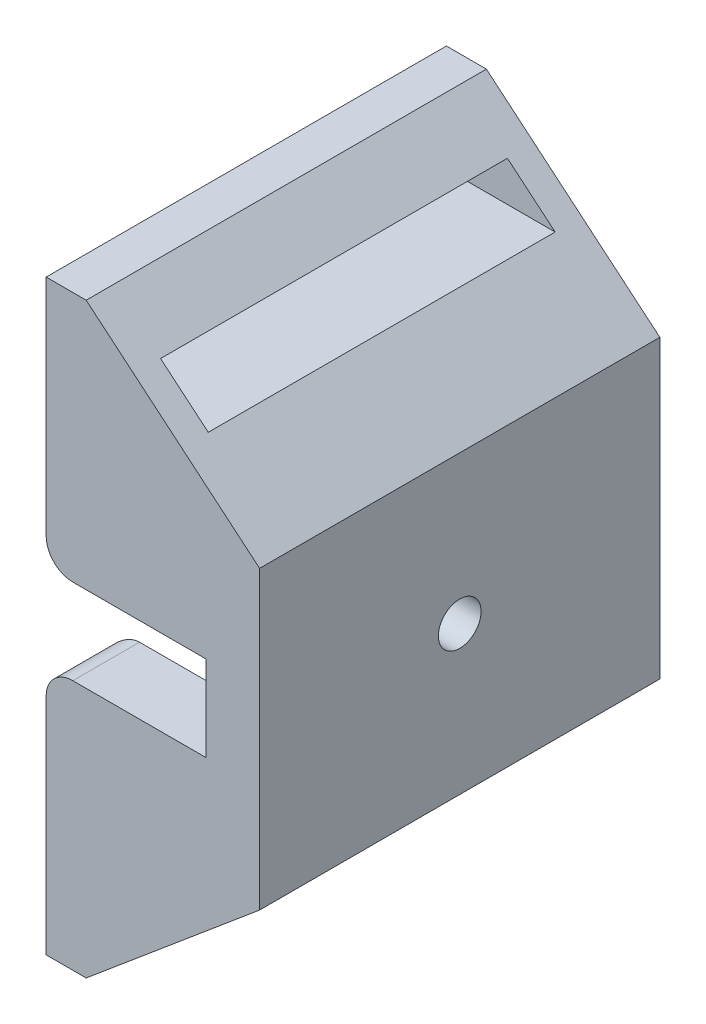
ISO-10303-21;
HEADER;
FILE_DESCRIPTION(('STEP AP214'),'2;1');
FILE_NAME('part.step','',(''),(''),'','','');
FILE_SCHEMA(('AUTOMOTIVE_DESIGN { 1 0 10303 214 1 1 1 1 }'));
ENDSEC;
DATA;
#1=APPLICATION_CONTEXT('core data for automotive mechanical design processes');
#2=APPLICATION_PROTOCOL_DEFINITION('international standard','automotive_design',2000,#1);
#3=PRODUCT_CONTEXT('',#1,'mechanical');
#4=PRODUCT('Part','Part','',(#3));
#5=PRODUCT_RELATED_PRODUCT_CATEGORY('part','',(#4));
#6=PRODUCT_DEFINITION_FORMATION('','',#4);
#7=PRODUCT_DEFINITION_CONTEXT('part definition',#1,'design');
#8=PRODUCT_DEFINITION('design','',#6,#7);
#9=PRODUCT_DEFINITION_SHAPE('','',#8);
#10=(LENGTH_UNIT() NAMED_UNIT(*) SI_UNIT(.MILLI.,.METRE.));
#11=(NAMED_UNIT(*) PLANE_ANGLE_UNIT() SI_UNIT($,.RADIAN.));
#12=(NAMED_UNIT(*) SI_UNIT($,.STERADIAN.) SOLID_ANGLE_UNIT());
#13=UNCERTAINTY_MEASURE_WITH_UNIT(LENGTH_MEASURE(1.E-05),#10,'distance_accuracy_value','');
#14=(GEOMETRIC_REPRESENTATION_CONTEXT(3) GLOBAL_UNCERTAINTY_ASSIGNED_CONTEXT((#13)) GLOBAL_UNIT_ASSIGNED_CONTEXT((#10,
#11,#12)) REPRESENTATION_CONTEXT('',''));
#15=CARTESIAN_POINT('',(0.,0.,0.));
#16=DIRECTION('',(0.,0.,1.));
#17=DIRECTION('',(1.,0.,0.));
#18=AXIS2_PLACEMENT_3D('',#15,#16,#17);
#19=CARTESIAN_POINT('',(-8.,-11.,0.));
#20=DIRECTION('',(0.,0.,-1.));
#21=DIRECTION('',(-1.,0.,0.));
#22=AXIS2_PLACEMENT_3D('',#19,#20,#21);
#23=PLANE('',#22);
#24=DIRECTION('',(0.,1.,0.));
#25=VECTOR('',#24,1.);
#26=CARTESIAN_POINT('',(-8.,-11.,0.));
#27=LINE('',#26,#25);
#28=CARTESIAN_POINT('',(-8.,2.6,0.));
#29=VERTEX_POINT('',#28);
#30=CARTESIAN_POINT('',(-8.,11.,0.));
#31=VERTEX_POINT('',#30);
#32=EDGE_CURVE('E516',#29,#31,#27,.T.);
#33=ORIENTED_EDGE('',*,*,#32,.F.);
#34=CARTESIAN_POINT('',(-7.,2.6,0.));
#35=DIRECTION('',(0.,0.,-1.));
#36=DIRECTION('',(-1.,0.,0.));
#37=AXIS2_PLACEMENT_3D('',#34,#35,#36);
#38=CIRCLE('',#37,1.);
#39=CARTESIAN_POINT('',(-7.,1.6,0.));
#40=VERTEX_POINT('',#39);
#41=EDGE_CURVE('E256',#29,#40,#38,.F.);
#42=ORIENTED_EDGE('',*,*,#41,.T.);
#43=DIRECTION('',(-1.,0.,0.));
#44=VECTOR('',#43,1.);
#45=CARTESIAN_POINT('',(-8.,1.6,0.));
#46=LINE('',#45,#44);
#47=CARTESIAN_POINT('',(-2.,1.6,0.));
#48=VERTEX_POINT('',#47);
#49=EDGE_CURVE('E545',#48,#40,#46,.T.);
#50=ORIENTED_EDGE('',*,*,#49,.F.);
#51=DIRECTION('',(0.,1.,0.));
#52=VECTOR('',#51,1.);
#53=CARTESIAN_POINT('',(-2.,1.6,0.));
#54=LINE('',#53,#52);
#55=CARTESIAN_POINT('',(-2.,-1.6,0.));
#56=VERTEX_POINT('',#55);
#57=EDGE_CURVE('E548',#56,#48,#54,.T.);
#58=ORIENTED_EDGE('',*,*,#57,.F.);
#59=DIRECTION('',(1.,0.,0.));
#60=VECTOR('',#59,1.);
#61=CARTESIAN_POINT('',(-8.,-1.6,0.));
#62=LINE('',#61,#60);
#63=CARTESIAN_POINT('',(-7.,-1.6,0.));
#64=VERTEX_POINT('',#63);
#65=EDGE_CURVE('E512',#64,#56,#62,.T.);
#66=ORIENTED_EDGE('',*,*,#65,.F.);
#67=CARTESIAN_POINT('',(-7.,-2.6,0.));
#68=DIRECTION('',(0.,0.,-1.));
#69=DIRECTION('',(-1.,0.,0.));
#70=AXIS2_PLACEMENT_3D('',#67,#68,#69);
#71=CIRCLE('',#70,1.);
#72=CARTESIAN_POINT('',(-8.,-2.6,0.));
#73=VERTEX_POINT('',#72);
#74=EDGE_CURVE('E253',#64,#73,#71,.F.);
#75=ORIENTED_EDGE('',*,*,#74,.T.);
#76=CARTESIAN_POINT('',(-8.,-11.,0.));
#77=VERTEX_POINT('',#76);
#78=EDGE_CURVE('E510',#77,#73,#27,.T.);
#79=ORIENTED_EDGE('',*,*,#78,.F.);
#80=DIRECTION('',(1.,0.,0.));
#81=VECTOR('',#80,1.);
#82=CARTESIAN_POINT('',(-8.,-11.,0.));
#83=LINE('',#82,#81);
#84=CARTESIAN_POINT('',(-6.5,-11.,0.));
#85=VERTEX_POINT('',#84);
#86=EDGE_CURVE('E222',#77,#85,#83,.T.);
#87=ORIENTED_EDGE('',*,*,#86,.T.);
#88=DIRECTION('',(-0.766044443118981,-0.642787609686535,0.));
#89=VECTOR('',#88,1.);
#90=CARTESIAN_POINT('',(-6.5,-11.,0.));
#91=LINE('',#90,#89);
#92=CARTESIAN_POINT('',(0.,-5.54585239734774,0.));
#93=VERTEX_POINT('',#92);
#94=EDGE_CURVE('E197',#93,#85,#91,.T.);
#95=ORIENTED_EDGE('',*,*,#94,.F.);
#96=DIRECTION('',(0.,1.,0.));
#97=VECTOR('',#96,1.);
#98=CARTESIAN_POINT('',(0.,-11.,0.));
#99=LINE('',#98,#97);
#100=CARTESIAN_POINT('',(0.,5.54585239734775,0.));
#101=VERTEX_POINT('',#100);
#102=EDGE_CURVE('E530',#93,#101,#99,.T.);
#103=ORIENTED_EDGE('',*,*,#102,.T.);
#104=DIRECTION('',(0.766044443118982,-0.642787609686534,0.));
#105=VECTOR('',#104,1.);
#106=CARTESIAN_POINT('',(-6.5,11.,0.));
#107=LINE('',#106,#105);
#108=CARTESIAN_POINT('',(-6.5,11.,0.));
#109=VERTEX_POINT('',#108);
#110=EDGE_CURVE('E656',#109,#101,#107,.T.);
#111=ORIENTED_EDGE('',*,*,#110,.F.);
#112=DIRECTION('',(1.,0.,0.));
#113=VECTOR('',#112,1.);
#114=CARTESIAN_POINT('',(-8.,11.,0.));
#115=LINE('',#114,#113);
#116=EDGE_CURVE('E227',#31,#109,#115,.T.);
#117=ORIENTED_EDGE('',*,*,#116,.F.);
#118=EDGE_LOOP('',(#33,#42,#50,#58,#66,#75,#79,#87,#95,#103,#111,#117));
#119=FACE_BOUND('',#118,.T.);
#120=ADVANCED_FACE('F45',(#119),#23,.F.);
#121=CARTESIAN_POINT('',(-8.,11.,-15.));
#122=DIRECTION('',(0.,-1.,0.));
#123=DIRECTION('',(0.,0.,-1.));
#124=AXIS2_PLACEMENT_3D('',#121,#122,#123);
#125=PLANE('',#124);
#126=ORIENTED_EDGE('',*,*,#116,.T.);
#127=DIRECTION('',(0.,0.,1.));
#128=VECTOR('',#127,1.);
#129=CARTESIAN_POINT('',(-6.5,11.,-15.));
#130=LINE('',#129,#128);
#131=CARTESIAN_POINT('',(-6.5,11.,-15.));
#132=VERTEX_POINT('',#131);
#133=EDGE_CURVE('E662',#132,#109,#130,.T.);
#134=ORIENTED_EDGE('',*,*,#133,.F.);
#135=DIRECTION('',(1.,0.,0.));
#136=VECTOR('',#135,1.);
#137=CARTESIAN_POINT('',(-8.,11.,-15.));
#138=LINE('',#137,#136);
#139=CARTESIAN_POINT('',(-8.,11.,-15.));
#140=VERTEX_POINT('',#139);
#141=EDGE_CURVE('E221',#140,#132,#138,.T.);
#142=ORIENTED_EDGE('',*,*,#141,.F.);
#143=DIRECTION('',(0.,0.,-1.));
#144=VECTOR('',#143,1.);
#145=CARTESIAN_POINT('',(-8.,11.,-15.));
#146=LINE('',#145,#144);
#147=EDGE_CURVE('E515',#31,#140,#146,.T.);
#148=ORIENTED_EDGE('',*,*,#147,.F.);
#149=EDGE_LOOP('',(#126,#134,#142,#148));
#150=FACE_BOUND('',#149,.T.);
#151=ADVANCED_FACE('F281',(#150),#125,.F.);
#152=CARTESIAN_POINT('',(-8.,-11.,-15.));
#153=DIRECTION('',(0.,0.,1.));
#154=DIRECTION('',(1.,0.,0.));
#155=AXIS2_PLACEMENT_3D('',#152,#153,#154);
#156=PLANE('',#155);
#157=DIRECTION('',(0.,-1.,0.));
#158=VECTOR('',#157,1.);
#159=CARTESIAN_POINT('',(0.,-11.,-15.));
#160=LINE('',#159,#158);
#161=CARTESIAN_POINT('',(0.,5.54585239734775,-15.));
#162=VERTEX_POINT('',#161);
#163=CARTESIAN_POINT('',(0.,-5.54585239734774,-15.));
#164=VERTEX_POINT('',#163);
#165=EDGE_CURVE('E215',#162,#164,#160,.T.);
#166=ORIENTED_EDGE('',*,*,#165,.T.);
#167=DIRECTION('',(-0.766044443118981,-0.642787609686535,0.));
#168=VECTOR('',#167,1.);
#169=CARTESIAN_POINT('',(-6.5,-11.,-15.));
#170=LINE('',#169,#168);
#171=CARTESIAN_POINT('',(-6.5,-11.,-15.));
#172=VERTEX_POINT('',#171);
#173=EDGE_CURVE('E194',#164,#172,#170,.T.);
#174=ORIENTED_EDGE('',*,*,#173,.T.);
#175=DIRECTION('',(1.,0.,0.));
#176=VECTOR('',#175,1.);
#177=CARTESIAN_POINT('',(-8.,-11.,-15.));
#178=LINE('',#177,#176);
#179=CARTESIAN_POINT('',(-8.,-11.,-15.));
#180=VERTEX_POINT('',#179);
#181=EDGE_CURVE('E211',#180,#172,#178,.T.);
#182=ORIENTED_EDGE('',*,*,#181,.F.);
#183=DIRECTION('',(0.,-1.,0.));
#184=VECTOR('',#183,1.);
#185=CARTESIAN_POINT('',(-8.,-11.,-15.));
#186=LINE('',#185,#184);
#187=EDGE_CURVE('E520',#140,#180,#186,.T.);
#188=ORIENTED_EDGE('',*,*,#187,.F.);
#189=ORIENTED_EDGE('',*,*,#141,.T.);
#190=DIRECTION('',(0.766044443118982,-0.642787609686534,0.));
#191=VECTOR('',#190,1.);
#192=CARTESIAN_POINT('',(-6.5,11.,-15.));
#193=LINE('',#192,#191);
#194=EDGE_CURVE('E659',#132,#162,#193,.T.);
#195=ORIENTED_EDGE('',*,*,#194,.T.);
#196=EDGE_LOOP('',(#166,#174,#182,#188,#189,#195));
#197=FACE_BOUND('',#196,.T.);
#198=ADVANCED_FACE('F209',(#197),#156,.F.);
#199=CARTESIAN_POINT('',(-8.,-11.,-15.));
#200=DIRECTION('',(0.,1.,0.));
#201=DIRECTION('',(0.,0.,1.));
#202=AXIS2_PLACEMENT_3D('',#199,#200,#201);
#203=PLANE('',#202);
#204=ORIENTED_EDGE('',*,*,#181,.T.);
#205=DIRECTION('',(0.,0.,1.));
#206=VECTOR('',#205,1.);
#207=CARTESIAN_POINT('',(-6.5,-11.,-15.));
#208=LINE('',#207,#206);
#209=EDGE_CURVE('E190',#172,#85,#208,.T.);
#210=ORIENTED_EDGE('',*,*,#209,.T.);
#211=ORIENTED_EDGE('',*,*,#86,.F.);
#212=DIRECTION('',(0.,0.,1.));
#213=VECTOR('',#212,1.);
#214=CARTESIAN_POINT('',(-8.,-11.,-15.));
#215=LINE('',#214,#213);
#216=EDGE_CURVE('E219',#180,#77,#215,.T.);
#217=ORIENTED_EDGE('',*,*,#216,.F.);
#218=EDGE_LOOP('',(#204,#210,#211,#217));
#219=FACE_BOUND('',#218,.T.);
#220=ADVANCED_FACE('F218',(#219),#203,.F.);
#221=CARTESIAN_POINT('',(-8.,0.,0.));
#222=DIRECTION('',(1.,0.,0.));
#223=DIRECTION('',(0.,0.,-1.));
#224=AXIS2_PLACEMENT_3D('',#221,#222,#223);
#225=PLANE('',#224);
#226=DIRECTION('',(0.,0.,1.));
#227=VECTOR('',#226,1.);
#228=CARTESIAN_POINT('',(-8.,-8.,0.));
#229=LINE('',#228,#227);
#230=CARTESIAN_POINT('',(-8.,-8.,-14.));
#231=VERTEX_POINT('',#230);
#232=CARTESIAN_POINT('',(-8.,-8.,-1.));
#233=VERTEX_POINT('',#232);
#234=EDGE_CURVE('E561',#231,#233,#229,.T.);
#235=ORIENTED_EDGE('',*,*,#234,.T.);
#236=DIRECTION('',(0.,-1.,0.));
#237=VECTOR('',#236,1.);
#238=CARTESIAN_POINT('',(-8.,0.,-1.));
#239=LINE('',#238,#237);
#240=CARTESIAN_POINT('',(-8.,-9.5,-1.));
#241=VERTEX_POINT('',#240);
#242=EDGE_CURVE('E557',#233,#241,#239,.T.);
#243=ORIENTED_EDGE('',*,*,#242,.T.);
#244=DIRECTION('',(0.,0.,-1.));
#245=VECTOR('',#244,1.);
#246=CARTESIAN_POINT('',(-8.,-9.5,0.));
#247=LINE('',#246,#245);
#248=CARTESIAN_POINT('',(-8.,-9.5,-14.));
#249=VERTEX_POINT('',#248);
#250=EDGE_CURVE('E569',#241,#249,#247,.T.);
#251=ORIENTED_EDGE('',*,*,#250,.T.);
#252=DIRECTION('',(0.,1.,0.));
#253=VECTOR('',#252,1.);
#254=CARTESIAN_POINT('',(-8.,0.,-14.));
#255=LINE('',#254,#253);
#256=EDGE_CURVE('E565',#249,#231,#255,.T.);
#257=ORIENTED_EDGE('',*,*,#256,.T.);
#258=EDGE_LOOP('',(#235,#243,#251,#257));
#259=FACE_BOUND('',#258,.T.);
#260=DIRECTION('',(0.,0.,1.));
#261=VECTOR('',#260,1.);
#262=CARTESIAN_POINT('',(-8.,9.5,0.));
#263=LINE('',#262,#261);
#264=CARTESIAN_POINT('',(-8.,9.5,-14.));
#265=VERTEX_POINT('',#264);
#266=CARTESIAN_POINT('',(-8.,9.5,-1.));
#267=VERTEX_POINT('',#266);
#268=EDGE_CURVE('E577',#265,#267,#263,.T.);
#269=ORIENTED_EDGE('',*,*,#268,.T.);
#270=DIRECTION('',(0.,-1.,0.));
#271=VECTOR('',#270,1.);
#272=CARTESIAN_POINT('',(-8.,0.,-1.));
#273=LINE('',#272,#271);
#274=CARTESIAN_POINT('',(-8.,8.,-1.));
#275=VERTEX_POINT('',#274);
#276=EDGE_CURVE('E573',#267,#275,#273,.T.);
#277=ORIENTED_EDGE('',*,*,#276,.T.);
#278=DIRECTION('',(0.,0.,-1.));
#279=VECTOR('',#278,1.);
#280=CARTESIAN_POINT('',(-8.,8.,0.));
#281=LINE('',#280,#279);
#282=CARTESIAN_POINT('',(-8.,8.,-14.));
#283=VERTEX_POINT('',#282);
#284=EDGE_CURVE('E585',#275,#283,#281,.T.);
#285=ORIENTED_EDGE('',*,*,#284,.T.);
#286=DIRECTION('',(0.,1.,0.));
#287=VECTOR('',#286,1.);
#288=CARTESIAN_POINT('',(-8.,0.,-14.));
#289=LINE('',#288,#287);
#290=EDGE_CURVE('E581',#283,#265,#289,.T.);
#291=ORIENTED_EDGE('',*,*,#290,.T.);
#292=EDGE_LOOP('',(#269,#277,#285,#291));
#293=FACE_BOUND('',#292,.T.);
#294=CARTESIAN_POINT('',(-8.,0.,-7.5));
#295=DIRECTION('',(1.,0.,0.));
#296=DIRECTION('',(0.,0.,-1.));
#297=AXIS2_PLACEMENT_3D('',#294,#295,#296);
#298=CIRCLE('',#297,6.25);
#299=CARTESIAN_POINT('',(-8.,-2.6,-1.81647116660784));
#300=VERTEX_POINT('',#299);
#301=CARTESIAN_POINT('',(-8.,2.6,-1.81647116660784));
#302=VERTEX_POINT('',#301);
#303=EDGE_CURVE('E243',#300,#302,#298,.T.);
#304=ORIENTED_EDGE('',*,*,#303,.T.);
#305=DIRECTION('',(0.,0.,1.));
#306=VECTOR('',#305,1.);
#307=CARTESIAN_POINT('',(-8.,2.6,0.));
#308=LINE('',#307,#306);
#309=EDGE_CURVE('E249',#302,#29,#308,.T.);
#310=ORIENTED_EDGE('',*,*,#309,.T.);
#311=ORIENTED_EDGE('',*,*,#32,.T.);
#312=ORIENTED_EDGE('',*,*,#147,.T.);
#313=ORIENTED_EDGE('',*,*,#187,.T.);
#314=ORIENTED_EDGE('',*,*,#216,.T.);
#315=ORIENTED_EDGE('',*,*,#78,.T.);
#316=DIRECTION('',(0.,0.,1.));
#317=VECTOR('',#316,1.);
#318=CARTESIAN_POINT('',(-8.,-2.6,0.));
#319=LINE('',#318,#317);
#320=EDGE_CURVE('E246',#73,#300,#319,.F.);
#321=ORIENTED_EDGE('',*,*,#320,.T.);
#322=EDGE_LOOP('',(#304,#310,#311,#312,#313,#314,#315,#321));
#323=FACE_BOUND('',#322,.T.);
#324=ADVANCED_FACE('F296',(#259,#293,#323),#225,.F.);
#325=CARTESIAN_POINT('',(0.,0.,0.));
#326=DIRECTION('',(1.,0.,0.));
#327=DIRECTION('',(0.,0.,-1.));
#328=AXIS2_PLACEMENT_3D('',#325,#326,#327);
#329=PLANE('',#328);
#330=DIRECTION('',(0.,0.,1.));
#331=VECTOR('',#330,1.);
#332=CARTESIAN_POINT('',(0.,-5.54585239734774,-15.));
#333=LINE('',#332,#331);
#334=EDGE_CURVE('E204',#164,#93,#333,.T.);
#335=ORIENTED_EDGE('',*,*,#334,.F.);
#336=ORIENTED_EDGE('',*,*,#165,.F.);
#337=DIRECTION('',(0.,0.,1.));
#338=VECTOR('',#337,1.);
#339=CARTESIAN_POINT('',(0.,5.54585239734775,-15.));
#340=LINE('',#339,#338);
#341=EDGE_CURVE('E665',#162,#101,#340,.T.);
#342=ORIENTED_EDGE('',*,*,#341,.T.);
#343=ORIENTED_EDGE('',*,*,#102,.F.);
#344=EDGE_LOOP('',(#335,#336,#342,#343));
#345=FACE_BOUND('',#344,.T.);
#346=CARTESIAN_POINT('',(0.,0.,-7.5));
#347=DIRECTION('',(-1.,0.,0.));
#348=DIRECTION('',(0.,0.,1.));
#349=AXIS2_PLACEMENT_3D('',#346,#347,#348);
#350=CIRCLE('',#349,0.800000000000001);
#351=CARTESIAN_POINT('',(0.,0.,-6.7));
#352=VERTEX_POINT('',#351);
#353=EDGE_CURVE('E621',#352,#352,#350,.T.);
#354=ORIENTED_EDGE('',*,*,#353,.T.);
#355=EDGE_LOOP('',(#354));
#356=FACE_BOUND('',#355,.T.);
#357=ADVANCED_FACE('F297',(#345,#356),#329,.T.);
#358=CARTESIAN_POINT('',(-2.,0.,-7.5));
#359=DIRECTION('',(-1.,0.,0.));
#360=DIRECTION('',(0.,0.,1.));
#361=AXIS2_PLACEMENT_3D('',#358,#359,#360);
#362=CYLINDRICAL_SURFACE('',#361,5.25);
#363=DIRECTION('',(-1.,0.,0.));
#364=VECTOR('',#363,1.);
#365=CARTESIAN_POINT('',(-2.,1.6,-2.49975000624969));
#366=LINE('',#365,#364);
#367=CARTESIAN_POINT('',(-7.,1.6,-2.49975000624969));
#368=VERTEX_POINT('',#367);
#369=CARTESIAN_POINT('',(-2.,1.6,-2.49975000624969));
#370=VERTEX_POINT('',#369);
#371=EDGE_CURVE('E554',#368,#370,#366,.F.);
#372=ORIENTED_EDGE('',*,*,#371,.F.);
#373=CARTESIAN_POINT('',(-7.,0.,-7.5));
#374=DIRECTION('',(1.,0.,0.));
#375=DIRECTION('',(0.,0.,-1.));
#376=AXIS2_PLACEMENT_3D('',#373,#374,#375);
#377=CIRCLE('',#376,5.25);
#378=CARTESIAN_POINT('',(-7.,-1.6,-2.49975000624969));
#379=VERTEX_POINT('',#378);
#380=EDGE_CURVE('E11',#368,#379,#377,.F.);
#381=ORIENTED_EDGE('',*,*,#380,.T.);
#382=DIRECTION('',(-1.,0.,0.));
#383=VECTOR('',#382,1.);
#384=CARTESIAN_POINT('',(-2.,-1.6,-2.49975000624969));
#385=LINE('',#384,#383);
#386=CARTESIAN_POINT('',(-2.,-1.6,-2.49975000624969));
#387=VERTEX_POINT('',#386);
#388=EDGE_CURVE('E537',#387,#379,#385,.T.);
#389=ORIENTED_EDGE('',*,*,#388,.F.);
#390=CARTESIAN_POINT('',(-2.,0.,-7.5));
#391=DIRECTION('',(-1.,0.,0.));
#392=DIRECTION('',(0.,0.,1.));
#393=AXIS2_PLACEMENT_3D('',#390,#391,#392);
#394=CIRCLE('',#393,5.25);
#395=EDGE_CURVE('E523',#370,#387,#394,.T.);
#396=ORIENTED_EDGE('',*,*,#395,.F.);
#397=EDGE_LOOP('',(#372,#381,#389,#396));
#398=FACE_BOUND('',#397,.T.);
#399=ADVANCED_FACE('F300',(#398),#362,.F.);
#400=CARTESIAN_POINT('',(-2.,0.,-7.5));
#401=DIRECTION('',(-1.,0.,0.));
#402=DIRECTION('',(0.,0.,1.));
#403=AXIS2_PLACEMENT_3D('',#400,#401,#402);
#404=PLANE('',#403);
#405=CARTESIAN_POINT('',(-2.,0.,-7.5));
#406=DIRECTION('',(-1.,0.,0.));
#407=DIRECTION('',(0.,0.,1.));
#408=AXIS2_PLACEMENT_3D('',#405,#406,#407);
#409=CIRCLE('',#408,0.800000000000001);
#410=CARTESIAN_POINT('',(-2.,0.,-6.7));
#411=VERTEX_POINT('',#410);
#412=EDGE_CURVE('E625',#411,#411,#409,.T.);
#413=ORIENTED_EDGE('',*,*,#412,.F.);
#414=EDGE_LOOP('',(#413));
#415=FACE_BOUND('',#414,.T.);
#416=ORIENTED_EDGE('',*,*,#395,.T.);
#417=DIRECTION('',(0.,0.,1.));
#418=VECTOR('',#417,1.);
#419=CARTESIAN_POINT('',(-2.,-1.6,-15.001));
#420=LINE('',#419,#418);
#421=EDGE_CURVE('E541',#387,#56,#420,.T.);
#422=ORIENTED_EDGE('',*,*,#421,.T.);
#423=ORIENTED_EDGE('',*,*,#57,.T.);
#424=DIRECTION('',(0.,0.,1.));
#425=VECTOR('',#424,1.);
#426=CARTESIAN_POINT('',(-2.,1.6,-15.001));
#427=LINE('',#426,#425);
#428=EDGE_CURVE('E539',#370,#48,#427,.T.);
#429=ORIENTED_EDGE('',*,*,#428,.F.);
#430=EDGE_LOOP('',(#416,#422,#423,#429));
#431=FACE_BOUND('',#430,.T.);
#432=ADVANCED_FACE('F306',(#415,#431),#404,.T.);
#433=CARTESIAN_POINT('',(-8.,1.6,-15.001));
#434=DIRECTION('',(0.,1.,0.));
#435=DIRECTION('',(0.,0.,1.));
#436=AXIS2_PLACEMENT_3D('',#433,#434,#435);
#437=PLANE('',#436);
#438=ORIENTED_EDGE('',*,*,#49,.T.);
#439=DIRECTION('',(0.,0.,1.));
#440=VECTOR('',#439,1.);
#441=CARTESIAN_POINT('',(-7.,1.6,-15.001));
#442=LINE('',#441,#440);
#443=EDGE_CURVE('E75',#40,#368,#442,.F.);
#444=ORIENTED_EDGE('',*,*,#443,.T.);
#445=ORIENTED_EDGE('',*,*,#371,.T.);
#446=ORIENTED_EDGE('',*,*,#428,.T.);
#447=EDGE_LOOP('',(#438,#444,#445,#446));
#448=FACE_BOUND('',#447,.T.);
#449=ADVANCED_FACE('F309',(#448),#437,.F.);
#450=CARTESIAN_POINT('',(-8.,-1.6,-15.001));
#451=DIRECTION('',(0.,-1.,0.));
#452=DIRECTION('',(0.,0.,-1.));
#453=AXIS2_PLACEMENT_3D('',#450,#451,#452);
#454=PLANE('',#453);
#455=ORIENTED_EDGE('',*,*,#388,.T.);
#456=DIRECTION('',(0.,0.,1.));
#457=VECTOR('',#456,1.);
#458=CARTESIAN_POINT('',(-7.,-1.6,-15.001));
#459=LINE('',#458,#457);
#460=EDGE_CURVE('E61',#379,#64,#459,.T.);
#461=ORIENTED_EDGE('',*,*,#460,.T.);
#462=ORIENTED_EDGE('',*,*,#65,.T.);
#463=ORIENTED_EDGE('',*,*,#421,.F.);
#464=EDGE_LOOP('',(#455,#461,#462,#463));
#465=FACE_BOUND('',#464,.T.);
#466=ADVANCED_FACE('F311',(#465),#454,.F.);
#467=CARTESIAN_POINT('',(-10.,9.5,-1.));
#468=DIRECTION('',(0.,0.,1.));
#469=DIRECTION('',(1.,0.,0.));
#470=AXIS2_PLACEMENT_3D('',#467,#468,#469);
#471=PLANE('',#470);
#472=DIRECTION('',(1.,0.,0.));
#473=VECTOR('',#472,1.);
#474=CARTESIAN_POINT('',(-10.,9.5,-1.));
#475=LINE('',#474,#473);
#476=CARTESIAN_POINT('',(-4.71236961110867,9.5,-1.));
#477=VERTEX_POINT('',#476);
#478=EDGE_CURVE('E617',#267,#477,#475,.T.);
#479=ORIENTED_EDGE('',*,*,#478,.T.);
#480=DIRECTION('',(0.766044443118982,-0.642787609686534,0.));
#481=VECTOR('',#480,1.);
#482=CARTESIAN_POINT('',(-7.815278496158,12.1036497010216,-1.));
#483=LINE('',#482,#481);
#484=CARTESIAN_POINT('',(-2.92473922221733,8.,-1.));
#485=VERTEX_POINT('',#484);
#486=EDGE_CURVE('E629',#477,#485,#483,.T.);
#487=ORIENTED_EDGE('',*,*,#486,.T.);
#488=DIRECTION('',(1.,0.,0.));
#489=VECTOR('',#488,1.);
#490=CARTESIAN_POINT('',(-10.,8.,-1.));
#491=LINE('',#490,#489);
#492=EDGE_CURVE('E605',#275,#485,#491,.T.);
#493=ORIENTED_EDGE('',*,*,#492,.F.);
#494=ORIENTED_EDGE('',*,*,#276,.F.);
#495=EDGE_LOOP('',(#479,#487,#493,#494));
#496=FACE_BOUND('',#495,.T.);
#497=ADVANCED_FACE('F314',(#496),#471,.F.);
#498=CARTESIAN_POINT('',(-10.,9.5,-1.));
#499=DIRECTION('',(0.,1.,0.));
#500=DIRECTION('',(0.,0.,1.));
#501=AXIS2_PLACEMENT_3D('',#498,#499,#500);
#502=PLANE('',#501);
#503=DIRECTION('',(1.,0.,0.));
#504=VECTOR('',#503,1.);
#505=CARTESIAN_POINT('',(-10.,9.5,-14.));
#506=LINE('',#505,#504);
#507=CARTESIAN_POINT('',(-4.71236961110867,9.5,-14.));
#508=VERTEX_POINT('',#507);
#509=EDGE_CURVE('E613',#265,#508,#506,.T.);
#510=ORIENTED_EDGE('',*,*,#509,.T.);
#511=DIRECTION('',(0.,0.,1.));
#512=VECTOR('',#511,1.);
#513=CARTESIAN_POINT('',(-4.71236961110867,9.5,-1.));
#514=LINE('',#513,#512);
#515=EDGE_CURVE('E633',#508,#477,#514,.T.);
#516=ORIENTED_EDGE('',*,*,#515,.T.);
#517=ORIENTED_EDGE('',*,*,#478,.F.);
#518=ORIENTED_EDGE('',*,*,#268,.F.);
#519=EDGE_LOOP('',(#510,#516,#517,#518));
#520=FACE_BOUND('',#519,.T.);
#521=ADVANCED_FACE('F318',(#520),#502,.F.);
#522=CARTESIAN_POINT('',(-10.,9.5,-14.));
#523=DIRECTION('',(0.,0.,-1.));
#524=DIRECTION('',(-1.,0.,0.));
#525=AXIS2_PLACEMENT_3D('',#522,#523,#524);
#526=PLANE('',#525);
#527=DIRECTION('',(1.,0.,0.));
#528=VECTOR('',#527,1.);
#529=CARTESIAN_POINT('',(-10.,8.,-14.));
#530=LINE('',#529,#528);
#531=CARTESIAN_POINT('',(-2.92473922221733,8.,-14.));
#532=VERTEX_POINT('',#531);
#533=EDGE_CURVE('E609',#283,#532,#530,.T.);
#534=ORIENTED_EDGE('',*,*,#533,.T.);
#535=DIRECTION('',(-0.766044443118982,0.642787609686534,0.));
#536=VECTOR('',#535,1.);
#537=CARTESIAN_POINT('',(-7.815278496158,12.1036497010216,-14.));
#538=LINE('',#537,#536);
#539=EDGE_CURVE('E637',#532,#508,#538,.T.);
#540=ORIENTED_EDGE('',*,*,#539,.T.);
#541=ORIENTED_EDGE('',*,*,#509,.F.);
#542=ORIENTED_EDGE('',*,*,#290,.F.);
#543=EDGE_LOOP('',(#534,#540,#541,#542));
#544=FACE_BOUND('',#543,.T.);
#545=ADVANCED_FACE('F321',(#544),#526,.F.);
#546=CARTESIAN_POINT('',(-10.,8.,-1.));
#547=DIRECTION('',(0.,-1.,0.));
#548=DIRECTION('',(0.,0.,-1.));
#549=AXIS2_PLACEMENT_3D('',#546,#547,#548);
#550=PLANE('',#549);
#551=ORIENTED_EDGE('',*,*,#492,.T.);
#552=DIRECTION('',(0.,0.,-1.));
#553=VECTOR('',#552,1.);
#554=CARTESIAN_POINT('',(-2.92473922221733,8.,-1.));
#555=LINE('',#554,#553);
#556=EDGE_CURVE('E239',#485,#532,#555,.T.);
#557=ORIENTED_EDGE('',*,*,#556,.T.);
#558=ORIENTED_EDGE('',*,*,#533,.F.);
#559=ORIENTED_EDGE('',*,*,#284,.F.);
#560=EDGE_LOOP('',(#551,#557,#558,#559));
#561=FACE_BOUND('',#560,.T.);
#562=ADVANCED_FACE('F325',(#561),#550,.F.);
#563=CARTESIAN_POINT('',(-10.,-9.5,-1.));
#564=DIRECTION('',(0.,0.,1.));
#565=DIRECTION('',(1.,0.,0.));
#566=AXIS2_PLACEMENT_3D('',#563,#564,#565);
#567=PLANE('',#566);
#568=DIRECTION('',(1.,0.,0.));
#569=VECTOR('',#568,1.);
#570=CARTESIAN_POINT('',(-10.,-8.,-1.));
#571=LINE('',#570,#569);
#572=CARTESIAN_POINT('',(-2.92473922221733,-8.,-1.));
#573=VERTEX_POINT('',#572);
#574=EDGE_CURVE('E589',#233,#573,#571,.T.);
#575=ORIENTED_EDGE('',*,*,#574,.T.);
#576=DIRECTION('',(-0.766044443118982,-0.642787609686535,0.));
#577=VECTOR('',#576,1.);
#578=CARTESIAN_POINT('',(-7.81527849615799,-12.1036497010216,-1.));
#579=LINE('',#578,#577);
#580=CARTESIAN_POINT('',(-4.71236961110867,-9.5,-1.));
#581=VERTEX_POINT('',#580);
#582=EDGE_CURVE('E641',#573,#581,#579,.T.);
#583=ORIENTED_EDGE('',*,*,#582,.T.);
#584=DIRECTION('',(1.,0.,0.));
#585=VECTOR('',#584,1.);
#586=CARTESIAN_POINT('',(-10.,-9.5,-1.));
#587=LINE('',#586,#585);
#588=EDGE_CURVE('E601',#241,#581,#587,.T.);
#589=ORIENTED_EDGE('',*,*,#588,.F.);
#590=ORIENTED_EDGE('',*,*,#242,.F.);
#591=EDGE_LOOP('',(#575,#583,#589,#590));
#592=FACE_BOUND('',#591,.T.);
#593=ADVANCED_FACE('F329',(#592),#567,.F.);
#594=CARTESIAN_POINT('',(-10.,-8.,-1.));
#595=DIRECTION('',(0.,1.,0.));
#596=DIRECTION('',(0.,0.,1.));
#597=AXIS2_PLACEMENT_3D('',#594,#595,#596);
#598=PLANE('',#597);
#599=DIRECTION('',(1.,0.,0.));
#600=VECTOR('',#599,1.);
#601=CARTESIAN_POINT('',(-10.,-8.,-14.));
#602=LINE('',#601,#600);
#603=CARTESIAN_POINT('',(-2.92473922221733,-8.,-14.));
#604=VERTEX_POINT('',#603);
#605=EDGE_CURVE('E593',#231,#604,#602,.T.);
#606=ORIENTED_EDGE('',*,*,#605,.T.);
#607=DIRECTION('',(0.,0.,1.));
#608=VECTOR('',#607,1.);
#609=CARTESIAN_POINT('',(-2.92473922221733,-8.,-1.));
#610=LINE('',#609,#608);
#611=EDGE_CURVE('E645',#604,#573,#610,.T.);
#612=ORIENTED_EDGE('',*,*,#611,.T.);
#613=ORIENTED_EDGE('',*,*,#574,.F.);
#614=ORIENTED_EDGE('',*,*,#234,.F.);
#615=EDGE_LOOP('',(#606,#612,#613,#614));
#616=FACE_BOUND('',#615,.T.);
#617=ADVANCED_FACE('F336',(#616),#598,.F.);
#618=CARTESIAN_POINT('',(-10.,-9.5,-14.));
#619=DIRECTION('',(0.,0.,-1.));
#620=DIRECTION('',(-1.,0.,0.));
#621=AXIS2_PLACEMENT_3D('',#618,#619,#620);
#622=PLANE('',#621);
#623=DIRECTION('',(1.,0.,0.));
#624=VECTOR('',#623,1.);
#625=CARTESIAN_POINT('',(-10.,-9.5,-14.));
#626=LINE('',#625,#624);
#627=CARTESIAN_POINT('',(-4.71236961110867,-9.5,-14.));
#628=VERTEX_POINT('',#627);
#629=EDGE_CURVE('E597',#249,#628,#626,.T.);
#630=ORIENTED_EDGE('',*,*,#629,.T.);
#631=DIRECTION('',(0.766044443118982,0.642787609686535,0.));
#632=VECTOR('',#631,1.);
#633=CARTESIAN_POINT('',(-7.81527849615799,-12.1036497010216,-14.));
#634=LINE('',#633,#632);
#635=EDGE_CURVE('E203',#628,#604,#634,.T.);
#636=ORIENTED_EDGE('',*,*,#635,.T.);
#637=ORIENTED_EDGE('',*,*,#605,.F.);
#638=ORIENTED_EDGE('',*,*,#256,.F.);
#639=EDGE_LOOP('',(#630,#636,#637,#638));
#640=FACE_BOUND('',#639,.T.);
#641=ADVANCED_FACE('F342',(#640),#622,.F.);
#642=CARTESIAN_POINT('',(-10.,-9.5,-1.));
#643=DIRECTION('',(0.,-1.,0.));
#644=DIRECTION('',(0.,0.,-1.));
#645=AXIS2_PLACEMENT_3D('',#642,#643,#644);
#646=PLANE('',#645);
#647=ORIENTED_EDGE('',*,*,#588,.T.);
#648=DIRECTION('',(0.,0.,-1.));
#649=VECTOR('',#648,1.);
#650=CARTESIAN_POINT('',(-4.71236961110867,-9.5,-1.));
#651=LINE('',#650,#649);
#652=EDGE_CURVE('E235',#581,#628,#651,.T.);
#653=ORIENTED_EDGE('',*,*,#652,.T.);
#654=ORIENTED_EDGE('',*,*,#629,.F.);
#655=ORIENTED_EDGE('',*,*,#250,.F.);
#656=EDGE_LOOP('',(#647,#653,#654,#655));
#657=FACE_BOUND('',#656,.T.);
#658=ADVANCED_FACE('F338',(#657),#646,.F.);
#659=CARTESIAN_POINT('',(0.,0.,-7.5));
#660=DIRECTION('',(-1.,0.,0.));
#661=DIRECTION('',(0.,0.,1.));
#662=AXIS2_PLACEMENT_3D('',#659,#660,#661);
#663=CYLINDRICAL_SURFACE('',#662,0.800000000000001);
#664=ORIENTED_EDGE('',*,*,#353,.F.);
#665=EDGE_LOOP('',(#664));
#666=FACE_BOUND('',#665,.T.);
#667=ORIENTED_EDGE('',*,*,#412,.T.);
#668=EDGE_LOOP('',(#667));
#669=FACE_BOUND('',#668,.T.);
#670=ADVANCED_FACE('F341',(#666,#669),#663,.F.);
#671=CARTESIAN_POINT('',(-6.5,-11.,-15.));
#672=DIRECTION('',(-0.642787609686535,0.766044443118981,0.));
#673=DIRECTION('',(-0.766044443118982,-0.642787609686535,0.));
#674=AXIS2_PLACEMENT_3D('',#671,#672,#673);
#675=PLANE('',#674);
#676=ORIENTED_EDGE('',*,*,#94,.T.);
#677=ORIENTED_EDGE('',*,*,#209,.F.);
#678=ORIENTED_EDGE('',*,*,#173,.F.);
#679=ORIENTED_EDGE('',*,*,#334,.T.);
#680=EDGE_LOOP('',(#676,#677,#678,#679));
#681=FACE_BOUND('',#680,.T.);
#682=ORIENTED_EDGE('',*,*,#611,.F.);
#683=ORIENTED_EDGE('',*,*,#635,.F.);
#684=ORIENTED_EDGE('',*,*,#652,.F.);
#685=ORIENTED_EDGE('',*,*,#582,.F.);
#686=EDGE_LOOP('',(#682,#683,#684,#685));
#687=FACE_BOUND('',#686,.T.);
#688=ADVANCED_FACE('F192',(#681,#687),#675,.F.);
#689=CARTESIAN_POINT('',(-6.5,11.,-15.));
#690=DIRECTION('',(-0.642787609686534,-0.766044443118982,0.));
#691=DIRECTION('',(0.766044443118982,-0.642787609686534,0.));
#692=AXIS2_PLACEMENT_3D('',#689,#690,#691);
#693=PLANE('',#692);
#694=ORIENTED_EDGE('',*,*,#110,.T.);
#695=ORIENTED_EDGE('',*,*,#341,.F.);
#696=ORIENTED_EDGE('',*,*,#194,.F.);
#697=ORIENTED_EDGE('',*,*,#133,.T.);
#698=EDGE_LOOP('',(#694,#695,#696,#697));
#699=FACE_BOUND('',#698,.T.);
#700=ORIENTED_EDGE('',*,*,#515,.F.);
#701=ORIENTED_EDGE('',*,*,#539,.F.);
#702=ORIENTED_EDGE('',*,*,#556,.F.);
#703=ORIENTED_EDGE('',*,*,#486,.F.);
#704=EDGE_LOOP('',(#700,#701,#702,#703));
#705=FACE_BOUND('',#704,.T.);
#706=ADVANCED_FACE('F353',(#699,#705),#693,.F.);
#707=CARTESIAN_POINT('',(-7.,-2.6,-15.001));
#708=DIRECTION('',(0.,0.,1.));
#709=DIRECTION('',(1.,0.,0.));
#710=AXIS2_PLACEMENT_3D('',#707,#708,#709);
#711=CYLINDRICAL_SURFACE('',#710,1.);
#712=ORIENTED_EDGE('',*,*,#74,.F.);
#713=ORIENTED_EDGE('',*,*,#460,.F.);
#714=CARTESIAN_POINT('',(-7.,-1.6,-2.49975000624969));
#715=CARTESIAN_POINT('',(-7.02442298275546,-1.59999781115702,-2.49975202983943));
#716=CARTESIAN_POINT('',(-7.04883232885827,-1.60089543747046,-2.49909633252425));
#717=CARTESIAN_POINT('',(-7.09743984455341,-1.60446062141405,-2.49649471638394));
#718=CARTESIAN_POINT('',(-7.12163811648831,-1.60712726671445,-2.49454946261746));
#719=CARTESIAN_POINT('',(-7.193351081136,-1.61768939930684,-2.48685128440566));
#720=CARTESIAN_POINT('',(-7.24032148756605,-1.62814801180713,-2.4792351750986));
#721=CARTESIAN_POINT('',(-7.33129772411312,-1.65527914529595,-2.45955036041585));
#722=CARTESIAN_POINT('',(-7.37530839788513,-1.67194120689296,-2.44748915009431));
#723=CARTESIAN_POINT('',(-7.45963555026878,-1.71067919276946,-2.41958146777516));
#724=CARTESIAN_POINT('',(-7.49994682050969,-1.73276259381956,-2.40372976896445));
#725=CARTESIAN_POINT('',(-7.57908343539719,-1.78328218604068,-2.36767036175844));
#726=CARTESIAN_POINT('',(-7.61757555072341,-1.81206859619967,-2.3472264342181));
#727=CARTESIAN_POINT('',(-7.68919971702068,-1.87388437656476,-2.30362319460844));
#728=CARTESIAN_POINT('',(-7.722330947587,-1.90691439480785,-2.28046346785948));
#729=CARTESIAN_POINT('',(-7.7886723018168,-1.98276466362593,-2.2276666675443));
#730=CARTESIAN_POINT('',(-7.82077635791117,-2.02626826855069,-2.19762167108729));
#731=CARTESIAN_POINT('',(-7.87718325751247,-2.11688114756562,-2.13560836394925));
#732=CARTESIAN_POINT('',(-7.9014742959258,-2.16399574593438,-2.10363722869353));
#733=CARTESIAN_POINT('',(-7.94743076348264,-2.27328913848924,-2.03015698732408));
#734=CARTESIAN_POINT('',(-7.96679811915584,-2.3362160650849,-1.98831693758835));
#735=CARTESIAN_POINT('',(-7.9928780761345,-2.46419757348501,-1.9042063406752));
#736=CARTESIAN_POINT('',(-7.99962052820077,-2.52924676551415,-1.86193704717552));
#737=CARTESIAN_POINT('',(-7.99999481655523,-2.59627987773225,-1.81886062654622));
#738=CARTESIAN_POINT('',(-8.00000000682428,-2.59813990011276,-1.8176657309681));
#739=CARTESIAN_POINT('',(-8.,-2.6,-1.81647116660784));
#740=B_SPLINE_CURVE_WITH_KNOTS('',3,(#714,#715,#716,#717,#718,#719,#720,#721,#722,#723,#724,
#725,#726,#727,#728,#729,#730,#731,#732,#733,#734,#735,#736,#737,#738,#739),.UNSPECIFIED.,.F.,
.F.,(4,2,2,2,2,2,2,2,2,2,2,2,4),(0.,0.0732174777535529,0.146397224647218,0.291758624379438,
0.436876037783533,0.582194723552494,0.738316166739807,0.894461479471627,1.07932325606407,
1.26446305189428,1.49741478672788,1.72981502344235,1.73644729303777),.UNSPECIFIED.);
#741=EDGE_CURVE('E50',#300,#379,#740,.F.);
#742=ORIENTED_EDGE('',*,*,#741,.F.);
#743=ORIENTED_EDGE('',*,*,#320,.F.);
#744=EDGE_LOOP('',(#712,#713,#742,#743));
#745=FACE_BOUND('',#744,.T.);
#746=ADVANCED_FACE('F47',(#745),#711,.T.);
#747=CARTESIAN_POINT('',(-7.,0.,-7.5));
#748=DIRECTION('',(1.,0.,0.));
#749=DIRECTION('',(0.,0.,-1.));
#750=AXIS2_PLACEMENT_3D('',#747,#748,#749);
#751=TOROIDAL_SURFACE('',#750,6.25,1.);
#752=ORIENTED_EDGE('',*,*,#741,.T.);
#753=ORIENTED_EDGE('',*,*,#380,.F.);
#754=CARTESIAN_POINT('',(-7.,1.6,-2.49975000624969));
#755=CARTESIAN_POINT('',(-7.02442298275546,1.59999781115702,-2.49975202983943));
#756=CARTESIAN_POINT('',(-7.04883232885827,1.60089543747046,-2.49909633252425));
#757=CARTESIAN_POINT('',(-7.09743984455341,1.60446062141405,-2.49649471638394));
#758=CARTESIAN_POINT('',(-7.12163811648831,1.60712726671445,-2.49454946261746));
#759=CARTESIAN_POINT('',(-7.193351081136,1.61768939930684,-2.48685128440566));
#760=CARTESIAN_POINT('',(-7.24032148756605,1.62814801180713,-2.4792351750986));
#761=CARTESIAN_POINT('',(-7.33129772411312,1.65527914529595,-2.45955036041585));
#762=CARTESIAN_POINT('',(-7.37530839788513,1.67194120689296,-2.44748915009431));
#763=CARTESIAN_POINT('',(-7.45963555026878,1.71067919276946,-2.41958146777516));
#764=CARTESIAN_POINT('',(-7.49994682050969,1.73276259381956,-2.40372976896445));
#765=CARTESIAN_POINT('',(-7.57908343539719,1.78328218604068,-2.36767036175844));
#766=CARTESIAN_POINT('',(-7.61757555072341,1.81206859619967,-2.3472264342181));
#767=CARTESIAN_POINT('',(-7.68919971702068,1.87388437656476,-2.30362319460844));
#768=CARTESIAN_POINT('',(-7.722330947587,1.90691439480785,-2.28046346785948));
#769=CARTESIAN_POINT('',(-7.7886723018168,1.98276466362593,-2.22766666754429));
#770=CARTESIAN_POINT('',(-7.82077635791117,2.02626826855069,-2.19762167108729));
#771=CARTESIAN_POINT('',(-7.87718325751247,2.11688114756562,-2.13560836394925));
#772=CARTESIAN_POINT('',(-7.9014742959258,2.16399574593438,-2.10363722869353));
#773=CARTESIAN_POINT('',(-7.94743076348264,2.27328913848924,-2.03015698732408));
#774=CARTESIAN_POINT('',(-7.96679811915584,2.33621606508489,-1.98831693758834));
#775=CARTESIAN_POINT('',(-7.9928780761345,2.46419757348501,-1.9042063406752));
#776=CARTESIAN_POINT('',(-7.99962052820077,2.52924676551416,-1.86193704717555));
#777=CARTESIAN_POINT('',(-7.99999481655523,2.59627987773225,-1.81886062654622));
#778=CARTESIAN_POINT('',(-8.00000000682428,2.59813990011276,-1.8176657309681));
#779=CARTESIAN_POINT('',(-8.,2.6,-1.81647116660784));
#780=B_SPLINE_CURVE_WITH_KNOTS('',3,(#754,#755,#756,#757,#758,#759,#760,#761,#762,#763,#764,
#765,#766,#767,#768,#769,#770,#771,#772,#773,#774,#775,#776,#777,#778,#779),.UNSPECIFIED.,.F.,
.F.,(4,2,2,2,2,2,2,2,2,2,2,2,4),(0.,0.0732174777535529,0.146397224647218,0.291758624379438,
0.436876037783533,0.582194723552494,0.738316166739807,0.894461479471627,1.07932325606407,
1.26446305189428,1.49741478672788,1.72981502344235,1.73644729303777),.UNSPECIFIED.);
#781=EDGE_CURVE('E262',#302,#368,#780,.F.);
#782=ORIENTED_EDGE('',*,*,#781,.F.);
#783=ORIENTED_EDGE('',*,*,#303,.F.);
#784=EDGE_LOOP('',(#752,#753,#782,#783));
#785=FACE_BOUND('',#784,.T.);
#786=ADVANCED_FACE('F269',(#785),#751,.T.);
#787=CARTESIAN_POINT('',(-7.,2.6,0.));
#788=DIRECTION('',(0.,0.,1.));
#789=DIRECTION('',(1.,0.,0.));
#790=AXIS2_PLACEMENT_3D('',#787,#788,#789);
#791=CYLINDRICAL_SURFACE('',#790,1.);
#792=ORIENTED_EDGE('',*,*,#781,.T.);
#793=ORIENTED_EDGE('',*,*,#443,.F.);
#794=ORIENTED_EDGE('',*,*,#41,.F.);
#795=ORIENTED_EDGE('',*,*,#309,.F.);
#796=EDGE_LOOP('',(#792,#793,#794,#795));
#797=FACE_BOUND('',#796,.T.);
#798=ADVANCED_FACE('F272',(#797),#791,.T.);
#799=CLOSED_SHELL('',(#120,#151,#198,#220,#324,#357,#399,#432,#449,#466,#497,#521,#545,#562,
#593,#617,#641,#658,#670,#688,#706,#746,#786,#798));
#800=MANIFOLD_SOLID_BREP('B2',#799);
#801=ADVANCED_BREP_SHAPE_REPRESENTATION('',(#18,#800),#14);
#802=SHAPE_DEFINITION_REPRESENTATION(#9,#801);
ENDSEC;
END-ISO-10303-21;
